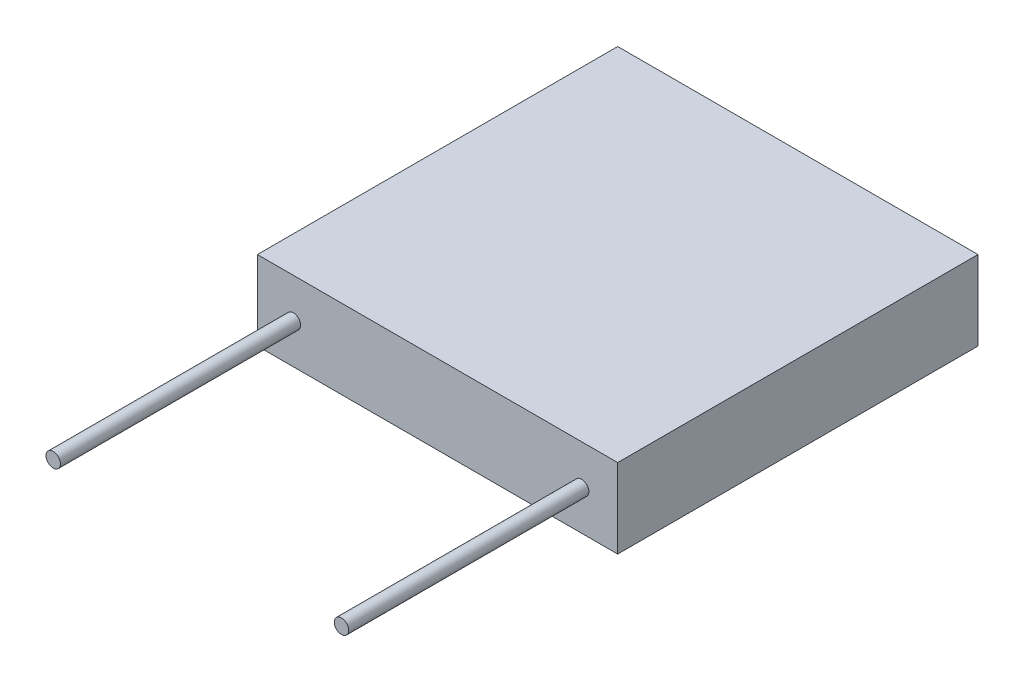
ISO-10303-21;
HEADER;
FILE_DESCRIPTION(('STEP AP214'),'2;1');
FILE_NAME('part.step','',(''),(''),'','','');
FILE_SCHEMA(('AUTOMOTIVE_DESIGN { 1 0 10303 214 1 1 1 1 }'));
ENDSEC;
DATA;
#1=APPLICATION_CONTEXT('core data for automotive mechanical design processes');
#2=APPLICATION_PROTOCOL_DEFINITION('international standard','automotive_design',2000,#1);
#3=PRODUCT_CONTEXT('',#1,'mechanical');
#4=PRODUCT('Part','Part','',(#3));
#5=PRODUCT_RELATED_PRODUCT_CATEGORY('part','',(#4));
#6=PRODUCT_DEFINITION_FORMATION('','',#4);
#7=PRODUCT_DEFINITION_CONTEXT('part definition',#1,'design');
#8=PRODUCT_DEFINITION('design','',#6,#7);
#9=PRODUCT_DEFINITION_SHAPE('','',#8);
#10=(LENGTH_UNIT() NAMED_UNIT(*) SI_UNIT(.MILLI.,.METRE.));
#11=(NAMED_UNIT(*) PLANE_ANGLE_UNIT() SI_UNIT($,.RADIAN.));
#12=(NAMED_UNIT(*) SI_UNIT($,.STERADIAN.) SOLID_ANGLE_UNIT());
#13=UNCERTAINTY_MEASURE_WITH_UNIT(LENGTH_MEASURE(1.E-05),#10,'distance_accuracy_value','');
#14=(GEOMETRIC_REPRESENTATION_CONTEXT(3) GLOBAL_UNCERTAINTY_ASSIGNED_CONTEXT((#13)) GLOBAL_UNIT_ASSIGNED_CONTEXT((#10,
#11,#12)) REPRESENTATION_CONTEXT('',''));
#15=CARTESIAN_POINT('',(0.,0.,0.));
#16=DIRECTION('',(0.,0.,1.));
#17=DIRECTION('',(1.,0.,0.));
#18=AXIS2_PLACEMENT_3D('',#15,#16,#17);
#19=CARTESIAN_POINT('',(-7.5,3.3,7.5));
#20=DIRECTION('',(0.,0.,-1.));
#21=DIRECTION('',(-1.,0.,0.));
#22=AXIS2_PLACEMENT_3D('',#19,#20,#21);
#23=PLANE('',#22);
#24=CARTESIAN_POINT('',(-6.,1.65,7.5));
#25=DIRECTION('',(0.,0.,-1.));
#26=DIRECTION('',(-1.,0.,0.));
#27=AXIS2_PLACEMENT_3D('',#24,#25,#26);
#28=CIRCLE('',#27,0.3);
#29=CARTESIAN_POINT('',(-6.3,1.65,7.5));
#30=VERTEX_POINT('',#29);
#31=EDGE_CURVE('E43',#30,#30,#28,.F.);
#32=ORIENTED_EDGE('',*,*,#31,.F.);
#33=EDGE_LOOP('',(#32));
#34=FACE_BOUND('',#33,.T.);
#35=DIRECTION('',(1.,0.,0.));
#36=VECTOR('',#35,1.);
#37=CARTESIAN_POINT('',(-7.5,0.,7.5));
#38=LINE('',#37,#36);
#39=CARTESIAN_POINT('',(-7.5,0.,7.5));
#40=VERTEX_POINT('',#39);
#41=CARTESIAN_POINT('',(7.50000000000001,0.,7.5));
#42=VERTEX_POINT('',#41);
#43=EDGE_CURVE('E76',#40,#42,#38,.T.);
#44=ORIENTED_EDGE('',*,*,#43,.T.);
#45=DIRECTION('',(0.,-1.,0.));
#46=VECTOR('',#45,1.);
#47=CARTESIAN_POINT('',(7.50000000000001,3.3,7.5));
#48=LINE('',#47,#46);
#49=CARTESIAN_POINT('',(7.50000000000001,3.3,7.5));
#50=VERTEX_POINT('',#49);
#51=EDGE_CURVE('E93',#50,#42,#48,.T.);
#52=ORIENTED_EDGE('',*,*,#51,.F.);
#53=DIRECTION('',(1.,0.,0.));
#54=VECTOR('',#53,1.);
#55=CARTESIAN_POINT('',(-7.5,3.3,7.5));
#56=LINE('',#55,#54);
#57=CARTESIAN_POINT('',(-7.5,3.3,7.5));
#58=VERTEX_POINT('',#57);
#59=EDGE_CURVE('E90',#58,#50,#56,.T.);
#60=ORIENTED_EDGE('',*,*,#59,.F.);
#61=DIRECTION('',(0.,-1.,0.));
#62=VECTOR('',#61,1.);
#63=CARTESIAN_POINT('',(-7.5,3.3,7.5));
#64=LINE('',#63,#62);
#65=EDGE_CURVE('E88',#58,#40,#64,.T.);
#66=ORIENTED_EDGE('',*,*,#65,.T.);
#67=EDGE_LOOP('',(#44,#52,#60,#66));
#68=FACE_BOUND('',#67,.T.);
#69=CARTESIAN_POINT('',(6.,1.65,7.5));
#70=DIRECTION('',(0.,0.,-1.));
#71=DIRECTION('',(-1.,0.,0.));
#72=AXIS2_PLACEMENT_3D('',#69,#70,#71);
#73=CIRCLE('',#72,0.3);
#74=CARTESIAN_POINT('',(5.7,1.65,7.5));
#75=VERTEX_POINT('',#74);
#76=EDGE_CURVE('E11',#75,#75,#73,.F.);
#77=ORIENTED_EDGE('',*,*,#76,.F.);
#78=EDGE_LOOP('',(#77));
#79=FACE_BOUND('',#78,.T.);
#80=ADVANCED_FACE('F35',(#34,#68,#79),#23,.F.);
#81=CARTESIAN_POINT('',(-7.5,3.3,-7.5));
#82=DIRECTION('',(1.,0.,0.));
#83=DIRECTION('',(0.,0.,-1.));
#84=AXIS2_PLACEMENT_3D('',#81,#82,#83);
#85=PLANE('',#84);
#86=DIRECTION('',(0.,0.,1.));
#87=VECTOR('',#86,1.);
#88=CARTESIAN_POINT('',(-7.5,0.,-7.5));
#89=LINE('',#88,#87);
#90=CARTESIAN_POINT('',(-7.5,0.,-7.5));
#91=VERTEX_POINT('',#90);
#92=EDGE_CURVE('E81',#91,#40,#89,.T.);
#93=ORIENTED_EDGE('',*,*,#92,.T.);
#94=ORIENTED_EDGE('',*,*,#65,.F.);
#95=DIRECTION('',(0.,0.,1.));
#96=VECTOR('',#95,1.);
#97=CARTESIAN_POINT('',(-7.5,3.3,-7.5));
#98=LINE('',#97,#96);
#99=CARTESIAN_POINT('',(-7.5,3.3,-7.5));
#100=VERTEX_POINT('',#99);
#101=EDGE_CURVE('E107',#100,#58,#98,.T.);
#102=ORIENTED_EDGE('',*,*,#101,.F.);
#103=DIRECTION('',(0.,-1.,0.));
#104=VECTOR('',#103,1.);
#105=CARTESIAN_POINT('',(-7.5,3.3,-7.5));
#106=LINE('',#105,#104);
#107=EDGE_CURVE('E96',#100,#91,#106,.T.);
#108=ORIENTED_EDGE('',*,*,#107,.T.);
#109=EDGE_LOOP('',(#93,#94,#102,#108));
#110=FACE_BOUND('',#109,.T.);
#111=ADVANCED_FACE('F37',(#110),#85,.F.);
#112=CARTESIAN_POINT('',(7.5,3.3,-7.50000000000001));
#113=DIRECTION('',(-1.,0.,0.));
#114=DIRECTION('',(0.,0.,1.));
#115=AXIS2_PLACEMENT_3D('',#112,#113,#114);
#116=PLANE('',#115);
#117=DIRECTION('',(0.,0.,-1.));
#118=VECTOR('',#117,1.);
#119=CARTESIAN_POINT('',(7.5,0.,-7.50000000000001));
#120=LINE('',#119,#118);
#121=CARTESIAN_POINT('',(7.5,0.,-7.50000000000001));
#122=VERTEX_POINT('',#121);
#123=EDGE_CURVE('E82',#42,#122,#120,.T.);
#124=ORIENTED_EDGE('',*,*,#123,.T.);
#125=DIRECTION('',(0.,-1.,0.));
#126=VECTOR('',#125,1.);
#127=CARTESIAN_POINT('',(7.5,3.3,-7.50000000000001));
#128=LINE('',#127,#126);
#129=CARTESIAN_POINT('',(7.5,3.3,-7.50000000000001));
#130=VERTEX_POINT('',#129);
#131=EDGE_CURVE('E113',#130,#122,#128,.T.);
#132=ORIENTED_EDGE('',*,*,#131,.F.);
#133=DIRECTION('',(0.,0.,-1.));
#134=VECTOR('',#133,1.);
#135=CARTESIAN_POINT('',(7.5,3.3,-7.50000000000001));
#136=LINE('',#135,#134);
#137=EDGE_CURVE('E55',#50,#130,#136,.T.);
#138=ORIENTED_EDGE('',*,*,#137,.F.);
#139=ORIENTED_EDGE('',*,*,#51,.T.);
#140=EDGE_LOOP('',(#124,#132,#138,#139));
#141=FACE_BOUND('',#140,.T.);
#142=ADVANCED_FACE('F125',(#141),#116,.F.);
#143=CARTESIAN_POINT('',(-7.5,3.3,-7.5));
#144=DIRECTION('',(0.,0.,1.));
#145=DIRECTION('',(1.,0.,0.));
#146=AXIS2_PLACEMENT_3D('',#143,#144,#145);
#147=PLANE('',#146);
#148=DIRECTION('',(-1.,0.,0.));
#149=VECTOR('',#148,1.);
#150=CARTESIAN_POINT('',(-7.5,0.,-7.5));
#151=LINE('',#150,#149);
#152=EDGE_CURVE('E105',#122,#91,#151,.T.);
#153=ORIENTED_EDGE('',*,*,#152,.T.);
#154=ORIENTED_EDGE('',*,*,#107,.F.);
#155=DIRECTION('',(-1.,0.,0.));
#156=VECTOR('',#155,1.);
#157=CARTESIAN_POINT('',(-7.5,3.3,-7.5));
#158=LINE('',#157,#156);
#159=EDGE_CURVE('E50',#130,#100,#158,.T.);
#160=ORIENTED_EDGE('',*,*,#159,.F.);
#161=ORIENTED_EDGE('',*,*,#131,.T.);
#162=EDGE_LOOP('',(#153,#154,#160,#161));
#163=FACE_BOUND('',#162,.T.);
#164=ADVANCED_FACE('F129',(#163),#147,.F.);
#165=CARTESIAN_POINT('',(-7.5,3.3,7.5));
#166=DIRECTION('',(0.,1.,0.));
#167=DIRECTION('',(0.,0.,1.));
#168=AXIS2_PLACEMENT_3D('',#165,#166,#167);
#169=PLANE('',#168);
#170=ORIENTED_EDGE('',*,*,#101,.T.);
#171=ORIENTED_EDGE('',*,*,#59,.T.);
#172=ORIENTED_EDGE('',*,*,#137,.T.);
#173=ORIENTED_EDGE('',*,*,#159,.T.);
#174=EDGE_LOOP('',(#170,#171,#172,#173));
#175=FACE_BOUND('',#174,.T.);
#176=ADVANCED_FACE('F133',(#175),#169,.T.);
#177=CARTESIAN_POINT('',(-7.5,0.,7.5));
#178=DIRECTION('',(0.,1.,0.));
#179=DIRECTION('',(0.,0.,1.));
#180=AXIS2_PLACEMENT_3D('',#177,#178,#179);
#181=PLANE('',#180);
#182=ORIENTED_EDGE('',*,*,#92,.F.);
#183=ORIENTED_EDGE('',*,*,#152,.F.);
#184=ORIENTED_EDGE('',*,*,#123,.F.);
#185=ORIENTED_EDGE('',*,*,#43,.F.);
#186=EDGE_LOOP('',(#182,#183,#184,#185));
#187=FACE_BOUND('',#186,.T.);
#188=ADVANCED_FACE('F78',(#187),#181,.F.);
#189=CARTESIAN_POINT('',(-6.,1.65,17.5));
#190=DIRECTION('',(0.,0.,-1.));
#191=DIRECTION('',(-1.,0.,0.));
#192=AXIS2_PLACEMENT_3D('',#189,#190,#191);
#193=CYLINDRICAL_SURFACE('',#192,0.3);
#194=CARTESIAN_POINT('',(-6.,1.65,17.5));
#195=DIRECTION('',(0.,0.,1.));
#196=DIRECTION('',(1.,0.,0.));
#197=AXIS2_PLACEMENT_3D('',#194,#195,#196);
#198=CIRCLE('',#197,0.3);
#199=CARTESIAN_POINT('',(-5.7,1.65,17.5));
#200=VERTEX_POINT('',#199);
#201=EDGE_CURVE('E97',#200,#200,#198,.T.);
#202=ORIENTED_EDGE('',*,*,#201,.F.);
#203=EDGE_LOOP('',(#202));
#204=FACE_BOUND('',#203,.T.);
#205=ORIENTED_EDGE('',*,*,#31,.T.);
#206=EDGE_LOOP('',(#205));
#207=FACE_BOUND('',#206,.T.);
#208=ADVANCED_FACE('F119',(#204,#207),#193,.T.);
#209=CARTESIAN_POINT('',(-6.,1.65,17.5));
#210=DIRECTION('',(0.,0.,1.));
#211=DIRECTION('',(1.,0.,0.));
#212=AXIS2_PLACEMENT_3D('',#209,#210,#211);
#213=PLANE('',#212);
#214=ORIENTED_EDGE('',*,*,#201,.T.);
#215=EDGE_LOOP('',(#214));
#216=FACE_BOUND('',#215,.T.);
#217=ADVANCED_FACE('F141',(#216),#213,.T.);
#218=CARTESIAN_POINT('',(6.,1.65,17.5));
#219=DIRECTION('',(0.,0.,-1.));
#220=DIRECTION('',(-1.,0.,0.));
#221=AXIS2_PLACEMENT_3D('',#218,#219,#220);
#222=CYLINDRICAL_SURFACE('',#221,0.3);
#223=CARTESIAN_POINT('',(6.,1.65,17.5));
#224=DIRECTION('',(0.,0.,1.));
#225=DIRECTION('',(-1.,0.,0.));
#226=AXIS2_PLACEMENT_3D('',#223,#224,#225);
#227=CIRCLE('',#226,0.3);
#228=CARTESIAN_POINT('',(5.7,1.65,17.5));
#229=VERTEX_POINT('',#228);
#230=EDGE_CURVE('E100',#229,#229,#227,.T.);
#231=ORIENTED_EDGE('',*,*,#230,.F.);
#232=EDGE_LOOP('',(#231));
#233=FACE_BOUND('',#232,.T.);
#234=ORIENTED_EDGE('',*,*,#76,.T.);
#235=EDGE_LOOP('',(#234));
#236=FACE_BOUND('',#235,.T.);
#237=ADVANCED_FACE('F145',(#233,#236),#222,.T.);
#238=CARTESIAN_POINT('',(6.,1.65,17.5));
#239=DIRECTION('',(0.,0.,-1.));
#240=DIRECTION('',(-1.,0.,0.));
#241=AXIS2_PLACEMENT_3D('',#238,#239,#240);
#242=PLANE('',#241);
#243=ORIENTED_EDGE('',*,*,#230,.T.);
#244=EDGE_LOOP('',(#243));
#245=FACE_BOUND('',#244,.T.);
#246=ADVANCED_FACE('F149',(#245),#242,.F.);
#247=CLOSED_SHELL('',(#80,#111,#142,#164,#176,#188,#208,#217,#237,#246));
#248=MANIFOLD_SOLID_BREP('B2',#247);
#249=ADVANCED_BREP_SHAPE_REPRESENTATION('',(#18,#248),#14);
#250=SHAPE_DEFINITION_REPRESENTATION(#9,#249);
ENDSEC;
END-ISO-10303-21;
